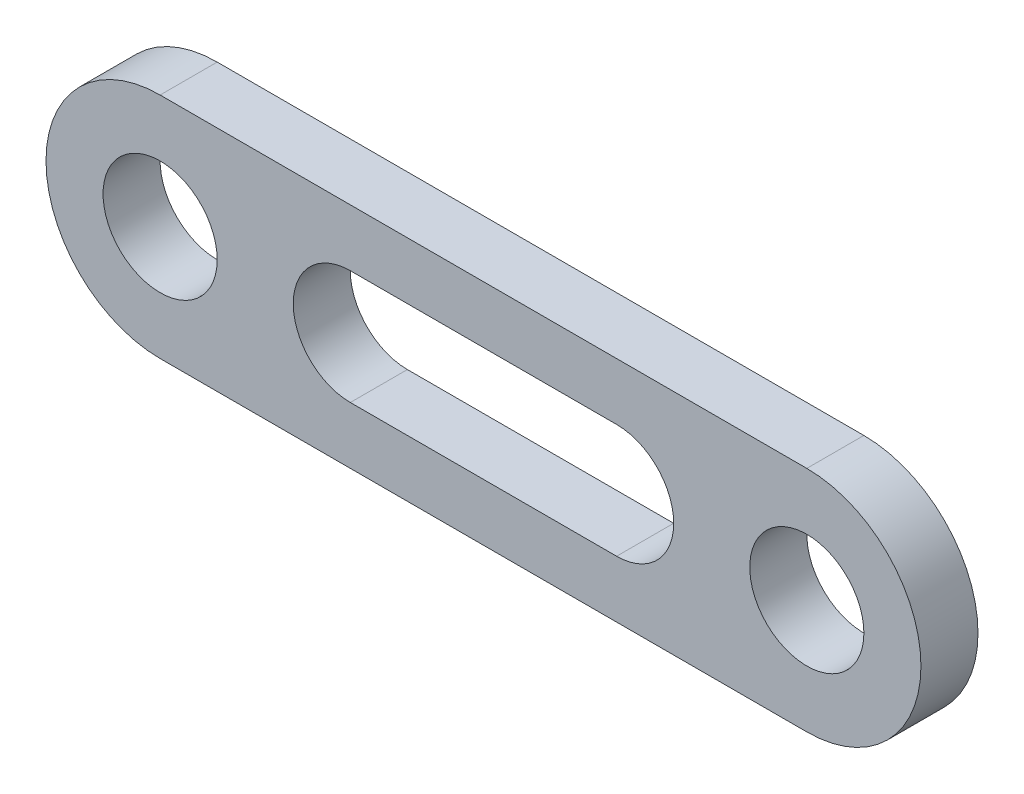
ISO-10303-21;
HEADER;
FILE_DESCRIPTION(('STEP AP214'),'2;1');
FILE_NAME('part.step','',(''),(''),'','','');
FILE_SCHEMA(('AUTOMOTIVE_DESIGN { 1 0 10303 214 1 1 1 1 }'));
ENDSEC;
DATA;
#1=APPLICATION_CONTEXT('core data for automotive mechanical design processes');
#2=APPLICATION_PROTOCOL_DEFINITION('international standard','automotive_design',2000,#1);
#3=PRODUCT_CONTEXT('',#1,'mechanical');
#4=PRODUCT('Part','Part','',(#3));
#5=PRODUCT_RELATED_PRODUCT_CATEGORY('part','',(#4));
#6=PRODUCT_DEFINITION_FORMATION('','',#4);
#7=PRODUCT_DEFINITION_CONTEXT('part definition',#1,'design');
#8=PRODUCT_DEFINITION('design','',#6,#7);
#9=PRODUCT_DEFINITION_SHAPE('','',#8);
#10=(LENGTH_UNIT() NAMED_UNIT(*) SI_UNIT(.MILLI.,.METRE.));
#11=(NAMED_UNIT(*) PLANE_ANGLE_UNIT() SI_UNIT($,.RADIAN.));
#12=(NAMED_UNIT(*) SI_UNIT($,.STERADIAN.) SOLID_ANGLE_UNIT());
#13=UNCERTAINTY_MEASURE_WITH_UNIT(LENGTH_MEASURE(1.E-05),#10,'distance_accuracy_value','');
#14=(GEOMETRIC_REPRESENTATION_CONTEXT(3) GLOBAL_UNCERTAINTY_ASSIGNED_CONTEXT((#13)) GLOBAL_UNIT_ASSIGNED_CONTEXT((#10,
#11,#12)) REPRESENTATION_CONTEXT('',''));
#15=CARTESIAN_POINT('',(0.,0.,0.));
#16=DIRECTION('',(0.,0.,1.));
#17=DIRECTION('',(1.,0.,0.));
#18=AXIS2_PLACEMENT_3D('',#15,#16,#17);
#19=CARTESIAN_POINT('',(0.,0.,3.));
#20=DIRECTION('',(0.,0.,1.));
#21=DIRECTION('',(1.,0.,0.));
#22=AXIS2_PLACEMENT_3D('',#19,#20,#21);
#23=PLANE('',#22);
#24=CARTESIAN_POINT('',(0.,0.,3.));
#25=DIRECTION('',(0.,0.,1.));
#26=DIRECTION('',(1.,0.,0.));
#27=AXIS2_PLACEMENT_3D('',#24,#25,#26);
#28=CIRCLE('',#27,3.);
#29=CARTESIAN_POINT('',(3.,0.,3.));
#30=VERTEX_POINT('',#29);
#31=EDGE_CURVE('E139',#30,#30,#28,.T.);
#32=ORIENTED_EDGE('',*,*,#31,.F.);
#33=EDGE_LOOP('',(#32));
#34=FACE_BOUND('',#33,.T.);
#35=CARTESIAN_POINT('',(0.,0.,3.));
#36=DIRECTION('',(0.,0.,1.));
#37=DIRECTION('',(1.,0.,0.));
#38=AXIS2_PLACEMENT_3D('',#35,#36,#37);
#39=CIRCLE('',#38,6.);
#40=CARTESIAN_POINT('',(0.,6.,3.));
#41=VERTEX_POINT('',#40);
#42=CARTESIAN_POINT('',(0.,-6.,3.));
#43=VERTEX_POINT('',#42);
#44=EDGE_CURVE('E145',#41,#43,#39,.T.);
#45=ORIENTED_EDGE('',*,*,#44,.T.);
#46=DIRECTION('',(1.,0.,0.));
#47=VECTOR('',#46,1.);
#48=CARTESIAN_POINT('',(0.,-6.,3.));
#49=LINE('',#48,#47);
#50=CARTESIAN_POINT('',(34.,-6.,3.));
#51=VERTEX_POINT('',#50);
#52=EDGE_CURVE('E148',#43,#51,#49,.T.);
#53=ORIENTED_EDGE('',*,*,#52,.T.);
#54=CARTESIAN_POINT('',(34.,0.,3.));
#55=DIRECTION('',(0.,0.,1.));
#56=DIRECTION('',(1.,0.,0.));
#57=AXIS2_PLACEMENT_3D('',#54,#55,#56);
#58=CIRCLE('',#57,6.);
#59=CARTESIAN_POINT('',(34.,6.,3.));
#60=VERTEX_POINT('',#59);
#61=EDGE_CURVE('E151',#51,#60,#58,.T.);
#62=ORIENTED_EDGE('',*,*,#61,.T.);
#63=DIRECTION('',(-1.,0.,0.));
#64=VECTOR('',#63,1.);
#65=CARTESIAN_POINT('',(0.,6.,3.));
#66=LINE('',#65,#64);
#67=EDGE_CURVE('E153',#60,#41,#66,.T.);
#68=ORIENTED_EDGE('',*,*,#67,.T.);
#69=EDGE_LOOP('',(#45,#53,#62,#68));
#70=FACE_BOUND('',#69,.T.);
#71=CARTESIAN_POINT('',(34.,0.,3.));
#72=DIRECTION('',(0.,0.,1.));
#73=DIRECTION('',(1.,0.,0.));
#74=AXIS2_PLACEMENT_3D('',#71,#72,#73);
#75=CIRCLE('',#74,2.99999999999999);
#76=CARTESIAN_POINT('',(37.,0.,3.));
#77=VERTEX_POINT('',#76);
#78=EDGE_CURVE('E133',#77,#77,#75,.T.);
#79=ORIENTED_EDGE('',*,*,#78,.F.);
#80=EDGE_LOOP('',(#79));
#81=FACE_BOUND('',#80,.T.);
#82=DIRECTION('',(1.,0.,0.));
#83=VECTOR('',#82,1.);
#84=CARTESIAN_POINT('',(10.,-3.,3.));
#85=LINE('',#84,#83);
#86=CARTESIAN_POINT('',(10.,-3.,3.));
#87=VERTEX_POINT('',#86);
#88=CARTESIAN_POINT('',(24.,-3.,3.));
#89=VERTEX_POINT('',#88);
#90=EDGE_CURVE('E105',#87,#89,#85,.T.);
#91=ORIENTED_EDGE('',*,*,#90,.F.);
#92=CARTESIAN_POINT('',(10.,0.,3.));
#93=DIRECTION('',(0.,0.,1.));
#94=DIRECTION('',(1.,0.,0.));
#95=AXIS2_PLACEMENT_3D('',#92,#93,#94);
#96=CIRCLE('',#95,3.);
#97=CARTESIAN_POINT('',(10.,3.,3.));
#98=VERTEX_POINT('',#97);
#99=EDGE_CURVE('E97',#98,#87,#96,.T.);
#100=ORIENTED_EDGE('',*,*,#99,.F.);
#101=DIRECTION('',(-1.,0.,0.));
#102=VECTOR('',#101,1.);
#103=CARTESIAN_POINT('',(10.,3.,3.));
#104=LINE('',#103,#102);
#105=CARTESIAN_POINT('',(24.,3.,3.));
#106=VERTEX_POINT('',#105);
#107=EDGE_CURVE('E119',#106,#98,#104,.T.);
#108=ORIENTED_EDGE('',*,*,#107,.F.);
#109=CARTESIAN_POINT('',(24.,0.,3.));
#110=DIRECTION('',(0.,0.,1.));
#111=DIRECTION('',(1.,0.,0.));
#112=AXIS2_PLACEMENT_3D('',#109,#110,#111);
#113=CIRCLE('',#112,3.);
#114=EDGE_CURVE('E117',#89,#106,#113,.T.);
#115=ORIENTED_EDGE('',*,*,#114,.F.);
#116=EDGE_LOOP('',(#91,#100,#108,#115));
#117=FACE_BOUND('',#116,.T.);
#118=ADVANCED_FACE('F32',(#34,#70,#81,#117),#23,.T.);
#119=CARTESIAN_POINT('',(0.,0.,0.));
#120=DIRECTION('',(0.,0.,1.));
#121=DIRECTION('',(1.,0.,0.));
#122=AXIS2_PLACEMENT_3D('',#119,#120,#121);
#123=PLANE('',#122);
#124=CARTESIAN_POINT('',(34.,0.,0.));
#125=DIRECTION('',(0.,0.,1.));
#126=DIRECTION('',(1.,0.,0.));
#127=AXIS2_PLACEMENT_3D('',#124,#125,#126);
#128=CIRCLE('',#127,2.99999999999999);
#129=CARTESIAN_POINT('',(37.,0.,0.));
#130=VERTEX_POINT('',#129);
#131=EDGE_CURVE('E113',#130,#130,#128,.T.);
#132=ORIENTED_EDGE('',*,*,#131,.T.);
#133=EDGE_LOOP('',(#132));
#134=FACE_BOUND('',#133,.T.);
#135=CARTESIAN_POINT('',(0.,0.,0.));
#136=DIRECTION('',(0.,0.,1.));
#137=DIRECTION('',(1.,0.,0.));
#138=AXIS2_PLACEMENT_3D('',#135,#136,#137);
#139=CIRCLE('',#138,3.);
#140=CARTESIAN_POINT('',(3.,0.,0.));
#141=VERTEX_POINT('',#140);
#142=EDGE_CURVE('E136',#141,#141,#139,.T.);
#143=ORIENTED_EDGE('',*,*,#142,.T.);
#144=EDGE_LOOP('',(#143));
#145=FACE_BOUND('',#144,.T.);
#146=CARTESIAN_POINT('',(0.,0.,0.));
#147=DIRECTION('',(0.,0.,1.));
#148=DIRECTION('',(1.,0.,0.));
#149=AXIS2_PLACEMENT_3D('',#146,#147,#148);
#150=CIRCLE('',#149,6.);
#151=CARTESIAN_POINT('',(0.,6.,0.));
#152=VERTEX_POINT('',#151);
#153=CARTESIAN_POINT('',(0.,-6.,0.));
#154=VERTEX_POINT('',#153);
#155=EDGE_CURVE('E142',#152,#154,#150,.T.);
#156=ORIENTED_EDGE('',*,*,#155,.F.);
#157=DIRECTION('',(-1.,0.,0.));
#158=VECTOR('',#157,1.);
#159=CARTESIAN_POINT('',(0.,6.,0.));
#160=LINE('',#159,#158);
#161=CARTESIAN_POINT('',(34.,6.,0.));
#162=VERTEX_POINT('',#161);
#163=EDGE_CURVE('E149',#162,#152,#160,.T.);
#164=ORIENTED_EDGE('',*,*,#163,.F.);
#165=CARTESIAN_POINT('',(34.,0.,0.));
#166=DIRECTION('',(0.,0.,1.));
#167=DIRECTION('',(1.,0.,0.));
#168=AXIS2_PLACEMENT_3D('',#165,#166,#167);
#169=CIRCLE('',#168,6.);
#170=CARTESIAN_POINT('',(34.,-6.,0.));
#171=VERTEX_POINT('',#170);
#172=EDGE_CURVE('E160',#171,#162,#169,.T.);
#173=ORIENTED_EDGE('',*,*,#172,.F.);
#174=DIRECTION('',(1.,0.,0.));
#175=VECTOR('',#174,1.);
#176=CARTESIAN_POINT('',(0.,-6.,0.));
#177=LINE('',#176,#175);
#178=EDGE_CURVE('E158',#154,#171,#177,.T.);
#179=ORIENTED_EDGE('',*,*,#178,.F.);
#180=EDGE_LOOP('',(#156,#164,#173,#179));
#181=FACE_BOUND('',#180,.T.);
#182=CARTESIAN_POINT('',(10.,0.,0.));
#183=DIRECTION('',(0.,0.,1.));
#184=DIRECTION('',(1.,0.,0.));
#185=AXIS2_PLACEMENT_3D('',#182,#183,#184);
#186=CIRCLE('',#185,3.);
#187=CARTESIAN_POINT('',(10.,3.,0.));
#188=VERTEX_POINT('',#187);
#189=CARTESIAN_POINT('',(10.,-3.,0.));
#190=VERTEX_POINT('',#189);
#191=EDGE_CURVE('E55',#188,#190,#186,.T.);
#192=ORIENTED_EDGE('',*,*,#191,.T.);
#193=DIRECTION('',(1.,0.,0.));
#194=VECTOR('',#193,1.);
#195=CARTESIAN_POINT('',(10.,-3.,0.));
#196=LINE('',#195,#194);
#197=CARTESIAN_POINT('',(24.,-3.,0.));
#198=VERTEX_POINT('',#197);
#199=EDGE_CURVE('E112',#190,#198,#196,.T.);
#200=ORIENTED_EDGE('',*,*,#199,.T.);
#201=CARTESIAN_POINT('',(24.,0.,0.));
#202=DIRECTION('',(0.,0.,1.));
#203=DIRECTION('',(1.,0.,0.));
#204=AXIS2_PLACEMENT_3D('',#201,#202,#203);
#205=CIRCLE('',#204,3.);
#206=CARTESIAN_POINT('',(24.,3.,0.));
#207=VERTEX_POINT('',#206);
#208=EDGE_CURVE('E125',#198,#207,#205,.T.);
#209=ORIENTED_EDGE('',*,*,#208,.T.);
#210=DIRECTION('',(-1.,0.,0.));
#211=VECTOR('',#210,1.);
#212=CARTESIAN_POINT('',(10.,3.,0.));
#213=LINE('',#212,#211);
#214=EDGE_CURVE('E106',#207,#188,#213,.T.);
#215=ORIENTED_EDGE('',*,*,#214,.T.);
#216=EDGE_LOOP('',(#192,#200,#209,#215));
#217=FACE_BOUND('',#216,.T.);
#218=ADVANCED_FACE('F178',(#134,#145,#181,#217),#123,.F.);
#219=CARTESIAN_POINT('',(0.,0.,3.));
#220=DIRECTION('',(0.,0.,-1.));
#221=DIRECTION('',(-1.,0.,0.));
#222=AXIS2_PLACEMENT_3D('',#219,#220,#221);
#223=CYLINDRICAL_SURFACE('',#222,6.);
#224=ORIENTED_EDGE('',*,*,#155,.T.);
#225=DIRECTION('',(0.,0.,-1.));
#226=VECTOR('',#225,1.);
#227=CARTESIAN_POINT('',(0.,-6.,3.));
#228=LINE('',#227,#226);
#229=EDGE_CURVE('E11',#43,#154,#228,.T.);
#230=ORIENTED_EDGE('',*,*,#229,.F.);
#231=ORIENTED_EDGE('',*,*,#44,.F.);
#232=DIRECTION('',(0.,0.,-1.));
#233=VECTOR('',#232,1.);
#234=CARTESIAN_POINT('',(0.,6.,3.));
#235=LINE('',#234,#233);
#236=EDGE_CURVE('E155',#41,#152,#235,.T.);
#237=ORIENTED_EDGE('',*,*,#236,.T.);
#238=EDGE_LOOP('',(#224,#230,#231,#237));
#239=FACE_BOUND('',#238,.T.);
#240=ADVANCED_FACE('F34',(#239),#223,.T.);
#241=CARTESIAN_POINT('',(0.,-6.,3.));
#242=DIRECTION('',(0.,1.,0.));
#243=DIRECTION('',(-1.,0.,0.));
#244=AXIS2_PLACEMENT_3D('',#241,#242,#243);
#245=PLANE('',#244);
#246=ORIENTED_EDGE('',*,*,#178,.T.);
#247=DIRECTION('',(0.,0.,-1.));
#248=VECTOR('',#247,1.);
#249=CARTESIAN_POINT('',(34.,-6.,3.));
#250=LINE('',#249,#248);
#251=EDGE_CURVE('E40',#51,#171,#250,.T.);
#252=ORIENTED_EDGE('',*,*,#251,.F.);
#253=ORIENTED_EDGE('',*,*,#52,.F.);
#254=ORIENTED_EDGE('',*,*,#229,.T.);
#255=EDGE_LOOP('',(#246,#252,#253,#254));
#256=FACE_BOUND('',#255,.T.);
#257=ADVANCED_FACE('F189',(#256),#245,.F.);
#258=CARTESIAN_POINT('',(34.,0.,3.));
#259=DIRECTION('',(0.,0.,-1.));
#260=DIRECTION('',(-1.,0.,0.));
#261=AXIS2_PLACEMENT_3D('',#258,#259,#260);
#262=CYLINDRICAL_SURFACE('',#261,6.);
#263=ORIENTED_EDGE('',*,*,#172,.T.);
#264=DIRECTION('',(0.,0.,-1.));
#265=VECTOR('',#264,1.);
#266=CARTESIAN_POINT('',(34.,6.,3.));
#267=LINE('',#266,#265);
#268=EDGE_CURVE('E165',#60,#162,#267,.T.);
#269=ORIENTED_EDGE('',*,*,#268,.F.);
#270=ORIENTED_EDGE('',*,*,#61,.F.);
#271=ORIENTED_EDGE('',*,*,#251,.T.);
#272=EDGE_LOOP('',(#263,#269,#270,#271));
#273=FACE_BOUND('',#272,.T.);
#274=ADVANCED_FACE('F172',(#273),#262,.T.);
#275=CARTESIAN_POINT('',(0.,6.,3.));
#276=DIRECTION('',(0.,-1.,0.));
#277=DIRECTION('',(1.,0.,0.));
#278=AXIS2_PLACEMENT_3D('',#275,#276,#277);
#279=PLANE('',#278);
#280=ORIENTED_EDGE('',*,*,#163,.T.);
#281=ORIENTED_EDGE('',*,*,#236,.F.);
#282=ORIENTED_EDGE('',*,*,#67,.F.);
#283=ORIENTED_EDGE('',*,*,#268,.T.);
#284=EDGE_LOOP('',(#280,#281,#282,#283));
#285=FACE_BOUND('',#284,.T.);
#286=ADVANCED_FACE('F182',(#285),#279,.F.);
#287=CARTESIAN_POINT('',(0.,0.,3.));
#288=DIRECTION('',(0.,0.,-1.));
#289=DIRECTION('',(-1.,0.,0.));
#290=AXIS2_PLACEMENT_3D('',#287,#288,#289);
#291=CYLINDRICAL_SURFACE('',#290,3.);
#292=ORIENTED_EDGE('',*,*,#31,.T.);
#293=EDGE_LOOP('',(#292));
#294=FACE_BOUND('',#293,.T.);
#295=ORIENTED_EDGE('',*,*,#142,.F.);
#296=EDGE_LOOP('',(#295));
#297=FACE_BOUND('',#296,.T.);
#298=ADVANCED_FACE('F206',(#294,#297),#291,.F.);
#299=CARTESIAN_POINT('',(34.,0.,3.));
#300=DIRECTION('',(0.,0.,-1.));
#301=DIRECTION('',(-1.,0.,0.));
#302=AXIS2_PLACEMENT_3D('',#299,#300,#301);
#303=CYLINDRICAL_SURFACE('',#302,2.99999999999999);
#304=ORIENTED_EDGE('',*,*,#78,.T.);
#305=EDGE_LOOP('',(#304));
#306=FACE_BOUND('',#305,.T.);
#307=ORIENTED_EDGE('',*,*,#131,.F.);
#308=EDGE_LOOP('',(#307));
#309=FACE_BOUND('',#308,.T.);
#310=ADVANCED_FACE('F213',(#306,#309),#303,.F.);
#311=CARTESIAN_POINT('',(10.,0.,3.));
#312=DIRECTION('',(0.,0.,-1.));
#313=DIRECTION('',(-1.,0.,0.));
#314=AXIS2_PLACEMENT_3D('',#311,#312,#313);
#315=CYLINDRICAL_SURFACE('',#314,3.);
#316=ORIENTED_EDGE('',*,*,#191,.F.);
#317=DIRECTION('',(0.,0.,-1.));
#318=VECTOR('',#317,1.);
#319=CARTESIAN_POINT('',(10.,3.,3.));
#320=LINE('',#319,#318);
#321=EDGE_CURVE('E101',#98,#188,#320,.T.);
#322=ORIENTED_EDGE('',*,*,#321,.F.);
#323=ORIENTED_EDGE('',*,*,#99,.T.);
#324=DIRECTION('',(0.,0.,-1.));
#325=VECTOR('',#324,1.);
#326=CARTESIAN_POINT('',(10.,-3.,3.));
#327=LINE('',#326,#325);
#328=EDGE_CURVE('E100',#87,#190,#327,.T.);
#329=ORIENTED_EDGE('',*,*,#328,.T.);
#330=EDGE_LOOP('',(#316,#322,#323,#329));
#331=FACE_BOUND('',#330,.T.);
#332=ADVANCED_FACE('F99',(#331),#315,.F.);
#333=CARTESIAN_POINT('',(10.,-3.,3.));
#334=DIRECTION('',(0.,1.,0.));
#335=DIRECTION('',(-1.,0.,0.));
#336=AXIS2_PLACEMENT_3D('',#333,#334,#335);
#337=PLANE('',#336);
#338=ORIENTED_EDGE('',*,*,#199,.F.);
#339=ORIENTED_EDGE('',*,*,#328,.F.);
#340=ORIENTED_EDGE('',*,*,#90,.T.);
#341=DIRECTION('',(0.,0.,-1.));
#342=VECTOR('',#341,1.);
#343=CARTESIAN_POINT('',(24.,-3.,3.));
#344=LINE('',#343,#342);
#345=EDGE_CURVE('E114',#89,#198,#344,.T.);
#346=ORIENTED_EDGE('',*,*,#345,.T.);
#347=EDGE_LOOP('',(#338,#339,#340,#346));
#348=FACE_BOUND('',#347,.T.);
#349=ADVANCED_FACE('F109',(#348),#337,.T.);
#350=CARTESIAN_POINT('',(24.,0.,3.));
#351=DIRECTION('',(0.,0.,-1.));
#352=DIRECTION('',(-1.,0.,0.));
#353=AXIS2_PLACEMENT_3D('',#350,#351,#352);
#354=CYLINDRICAL_SURFACE('',#353,3.);
#355=ORIENTED_EDGE('',*,*,#208,.F.);
#356=ORIENTED_EDGE('',*,*,#345,.F.);
#357=ORIENTED_EDGE('',*,*,#114,.T.);
#358=DIRECTION('',(0.,0.,-1.));
#359=VECTOR('',#358,1.);
#360=CARTESIAN_POINT('',(24.,3.,3.));
#361=LINE('',#360,#359);
#362=EDGE_CURVE('E47',#106,#207,#361,.T.);
#363=ORIENTED_EDGE('',*,*,#362,.T.);
#364=EDGE_LOOP('',(#355,#356,#357,#363));
#365=FACE_BOUND('',#364,.T.);
#366=ADVANCED_FACE('F230',(#365),#354,.F.);
#367=CARTESIAN_POINT('',(10.,3.,3.));
#368=DIRECTION('',(0.,-1.,0.));
#369=DIRECTION('',(1.,0.,0.));
#370=AXIS2_PLACEMENT_3D('',#367,#368,#369);
#371=PLANE('',#370);
#372=ORIENTED_EDGE('',*,*,#214,.F.);
#373=ORIENTED_EDGE('',*,*,#362,.F.);
#374=ORIENTED_EDGE('',*,*,#107,.T.);
#375=ORIENTED_EDGE('',*,*,#321,.T.);
#376=EDGE_LOOP('',(#372,#373,#374,#375));
#377=FACE_BOUND('',#376,.T.);
#378=ADVANCED_FACE('F233',(#377),#371,.T.);
#379=CLOSED_SHELL('',(#118,#218,#240,#257,#274,#286,#298,#310,#332,#349,#366,#378));
#380=MANIFOLD_SOLID_BREP('B2',#379);
#381=ADVANCED_BREP_SHAPE_REPRESENTATION('',(#18,#380),#14);
#382=SHAPE_DEFINITION_REPRESENTATION(#9,#381);
ENDSEC;
END-ISO-10303-21;
